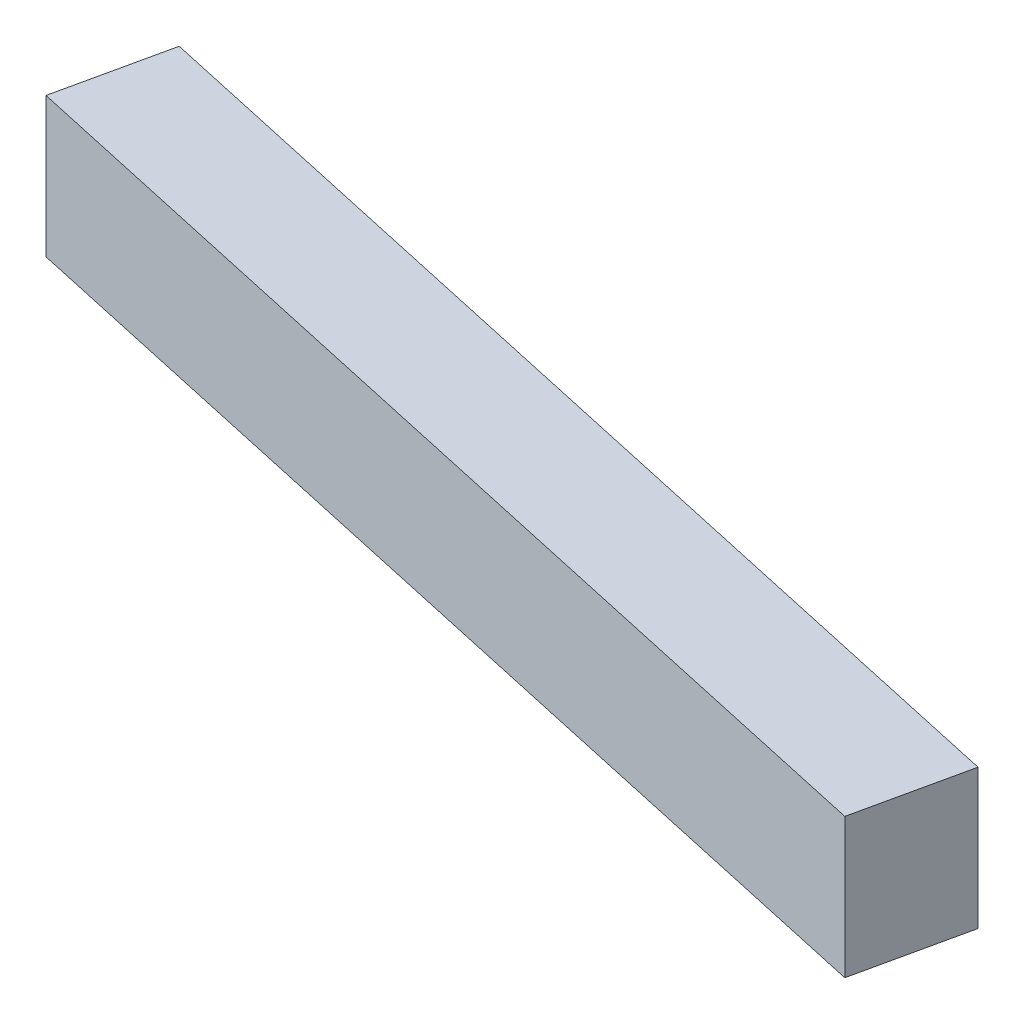
ISO-10303-21;
HEADER;
FILE_DESCRIPTION(('STEP AP214'),'2;1');
FILE_NAME('part.step','',(''),(''),'','','');
FILE_SCHEMA(('AUTOMOTIVE_DESIGN { 1 0 10303 214 1 1 1 1 }'));
ENDSEC;
DATA;
#1=APPLICATION_CONTEXT('core data for automotive mechanical design processes');
#2=APPLICATION_PROTOCOL_DEFINITION('international standard','automotive_design',2000,#1);
#3=PRODUCT_CONTEXT('',#1,'mechanical');
#4=PRODUCT('Part','Part','',(#3));
#5=PRODUCT_RELATED_PRODUCT_CATEGORY('part','',(#4));
#6=PRODUCT_DEFINITION_FORMATION('','',#4);
#7=PRODUCT_DEFINITION_CONTEXT('part definition',#1,'design');
#8=PRODUCT_DEFINITION('design','',#6,#7);
#9=PRODUCT_DEFINITION_SHAPE('','',#8);
#10=(LENGTH_UNIT() NAMED_UNIT(*) SI_UNIT(.MILLI.,.METRE.));
#11=(NAMED_UNIT(*) PLANE_ANGLE_UNIT() SI_UNIT($,.RADIAN.));
#12=(NAMED_UNIT(*) SI_UNIT($,.STERADIAN.) SOLID_ANGLE_UNIT());
#13=UNCERTAINTY_MEASURE_WITH_UNIT(LENGTH_MEASURE(1.E-05),#10,'distance_accuracy_value','');
#14=(GEOMETRIC_REPRESENTATION_CONTEXT(3) GLOBAL_UNCERTAINTY_ASSIGNED_CONTEXT((#13)) GLOBAL_UNIT_ASSIGNED_CONTEXT((#10,
#11,#12)) REPRESENTATION_CONTEXT('',''));
#15=CARTESIAN_POINT('',(0.,0.,0.));
#16=DIRECTION('',(0.,0.,1.));
#17=DIRECTION('',(1.,0.,0.));
#18=AXIS2_PLACEMENT_3D('',#15,#16,#17);
#19=CARTESIAN_POINT('',(-17.5987524858148,7.874,-3.76349059419512));
#20=DIRECTION('',(0.21459895589824,0.,-0.976702251521611));
#21=DIRECTION('',(-0.976702251521611,0.,-0.21459895589824));
#22=AXIS2_PLACEMENT_3D('',#19,#20,#21);
#23=PLANE('',#22);
#24=DIRECTION('',(0.,1.,0.));
#25=VECTOR('',#24,1.);
#26=CARTESIAN_POINT('',(-17.5987524858148,7.874,-3.76349059419512));
#27=LINE('',#26,#25);
#28=CARTESIAN_POINT('',(-17.5987524858148,7.62,-3.76349059419512));
#29=VERTEX_POINT('',#28);
#30=CARTESIAN_POINT('',(-17.5987524858148,7.874,-3.76349059419512));
#31=VERTEX_POINT('',#30);
#32=EDGE_CURVE('E20',#29,#31,#27,.T.);
#33=ORIENTED_EDGE('',*,*,#32,.T.);
#34=DIRECTION('',(-0.976702251521611,0.,-0.214598955898244));
#35=VECTOR('',#34,1.);
#36=CARTESIAN_POINT('',(-17.5987524858148,7.874,-3.76349059419512));
#37=LINE('',#36,#35);
#38=CARTESIAN_POINT('',(-19.4593702749634,7.874,-4.17230160518126));
#39=VERTEX_POINT('',#38);
#40=EDGE_CURVE('E55',#31,#39,#37,.T.);
#41=ORIENTED_EDGE('',*,*,#40,.T.);
#42=DIRECTION('',(0.,1.,0.));
#43=VECTOR('',#42,1.);
#44=CARTESIAN_POINT('',(-19.4593702749634,7.874,-4.17230160518126));
#45=LINE('',#44,#43);
#46=CARTESIAN_POINT('',(-19.4593702749634,7.62,-4.17230160518126));
#47=VERTEX_POINT('',#46);
#48=EDGE_CURVE('E76',#39,#47,#45,.F.);
#49=ORIENTED_EDGE('',*,*,#48,.T.);
#50=DIRECTION('',(-0.976702251521611,0.,-0.214598955898244));
#51=VECTOR('',#50,1.);
#52=CARTESIAN_POINT('',(-17.5987524858148,7.62,-3.76349059419512));
#53=LINE('',#52,#51);
#54=EDGE_CURVE('E58',#29,#47,#53,.T.);
#55=ORIENTED_EDGE('',*,*,#54,.F.);
#56=EDGE_LOOP('',(#33,#41,#49,#55));
#57=FACE_BOUND('',#56,.T.);
#58=ADVANCED_FACE('F17',(#57),#23,.F.);
#59=CARTESIAN_POINT('',(-17.5987524858148,7.874,-3.76349059419512));
#60=DIRECTION('',(-0.976702251521608,0.,-0.214598955898256));
#61=DIRECTION('',(-0.214598955898256,0.,0.976702251521608));
#62=AXIS2_PLACEMENT_3D('',#59,#60,#61);
#63=PLANE('',#62);
#64=DIRECTION('',(0.,1.,0.));
#65=VECTOR('',#64,1.);
#66=CARTESIAN_POINT('',(-17.5551459779762,7.874,-3.96195649170431));
#67=LINE('',#66,#65);
#68=CARTESIAN_POINT('',(-17.5551459779762,7.62,-3.96195649170432));
#69=VERTEX_POINT('',#68);
#70=CARTESIAN_POINT('',(-17.5551459779762,7.874,-3.96195649170432));
#71=VERTEX_POINT('',#70);
#72=EDGE_CURVE('E73',#69,#71,#67,.T.);
#73=ORIENTED_EDGE('',*,*,#72,.T.);
#74=DIRECTION('',(-0.214598955898602,0.,0.976702251521532));
#75=VECTOR('',#74,1.);
#76=CARTESIAN_POINT('',(-17.5551459779762,7.874,-3.96195649170431));
#77=LINE('',#76,#75);
#78=EDGE_CURVE('E63',#71,#31,#77,.T.);
#79=ORIENTED_EDGE('',*,*,#78,.T.);
#80=ORIENTED_EDGE('',*,*,#32,.F.);
#81=DIRECTION('',(-0.214598955898602,0.,0.976702251521532));
#82=VECTOR('',#81,1.);
#83=CARTESIAN_POINT('',(-17.5551459779762,7.62,-3.96195649170431));
#84=LINE('',#83,#82);
#85=EDGE_CURVE('E80',#69,#29,#84,.T.);
#86=ORIENTED_EDGE('',*,*,#85,.F.);
#87=EDGE_LOOP('',(#73,#79,#80,#86));
#88=FACE_BOUND('',#87,.T.);
#89=ADVANCED_FACE('F72',(#88),#63,.F.);
#90=CARTESIAN_POINT('',(-17.5987524858148,7.874,-3.76349059419512));
#91=DIRECTION('',(0.,-1.,0.));
#92=DIRECTION('',(0.,0.,-1.));
#93=AXIS2_PLACEMENT_3D('',#90,#91,#92);
#94=PLANE('',#93);
#95=ORIENTED_EDGE('',*,*,#78,.F.);
#96=DIRECTION('',(0.976702251521612,0.,0.214598955898237));
#97=VECTOR('',#96,1.);
#98=CARTESIAN_POINT('',(-17.5551459779762,7.874,-3.96195649170431));
#99=LINE('',#98,#97);
#100=CARTESIAN_POINT('',(-19.415763767427,7.874,-4.37076750275684));
#101=VERTEX_POINT('',#100);
#102=EDGE_CURVE('E83',#71,#101,#99,.F.);
#103=ORIENTED_EDGE('',*,*,#102,.T.);
#104=DIRECTION('',(0.214598954411368,0.,-0.976702251848304));
#105=VECTOR('',#104,1.);
#106=CARTESIAN_POINT('',(-19.4593702749634,7.874,-4.17230160518126));
#107=LINE('',#106,#105);
#108=EDGE_CURVE('E69',#101,#39,#107,.F.);
#109=ORIENTED_EDGE('',*,*,#108,.T.);
#110=ORIENTED_EDGE('',*,*,#40,.F.);
#111=EDGE_LOOP('',(#95,#103,#109,#110));
#112=FACE_BOUND('',#111,.T.);
#113=ADVANCED_FACE('F66',(#112),#94,.F.);
#114=CARTESIAN_POINT('',(-19.4593702749634,7.874,-4.17230160518126));
#115=DIRECTION('',(0.976702251848304,0.,0.214598954411368));
#116=DIRECTION('',(0.214598954411368,0.,-0.976702251848304));
#117=AXIS2_PLACEMENT_3D('',#114,#115,#116);
#118=PLANE('',#117);
#119=ORIENTED_EDGE('',*,*,#48,.F.);
#120=ORIENTED_EDGE('',*,*,#108,.F.);
#121=DIRECTION('',(0.,1.,0.));
#122=VECTOR('',#121,1.);
#123=CARTESIAN_POINT('',(-19.415763767427,7.874,-4.37076750275683));
#124=LINE('',#123,#122);
#125=CARTESIAN_POINT('',(-19.415763767427,7.62,-4.37076750275684));
#126=VERTEX_POINT('',#125);
#127=EDGE_CURVE('E26',#101,#126,#124,.F.);
#128=ORIENTED_EDGE('',*,*,#127,.T.);
#129=DIRECTION('',(0.214598954411426,0.,-0.976702251848291));
#130=VECTOR('',#129,1.);
#131=CARTESIAN_POINT('',(-19.4593702749634,7.62,-4.17230160518126));
#132=LINE('',#131,#130);
#133=EDGE_CURVE('E34',#47,#126,#132,.T.);
#134=ORIENTED_EDGE('',*,*,#133,.F.);
#135=EDGE_LOOP('',(#119,#120,#128,#134));
#136=FACE_BOUND('',#135,.T.);
#137=ADVANCED_FACE('F88',(#136),#118,.F.);
#138=CARTESIAN_POINT('',(-17.5987524858148,7.62,-3.76349059419512));
#139=DIRECTION('',(0.,-1.,0.));
#140=DIRECTION('',(0.,0.,-1.));
#141=AXIS2_PLACEMENT_3D('',#138,#139,#140);
#142=PLANE('',#141);
#143=DIRECTION('',(0.976702251521612,0.,0.214598955898237));
#144=VECTOR('',#143,1.);
#145=CARTESIAN_POINT('',(-17.5551459779762,7.62,-3.96195649170431));
#146=LINE('',#145,#144);
#147=EDGE_CURVE('E11',#126,#69,#146,.T.);
#148=ORIENTED_EDGE('',*,*,#147,.T.);
#149=ORIENTED_EDGE('',*,*,#85,.T.);
#150=ORIENTED_EDGE('',*,*,#54,.T.);
#151=ORIENTED_EDGE('',*,*,#133,.T.);
#152=EDGE_LOOP('',(#148,#149,#150,#151));
#153=FACE_BOUND('',#152,.T.);
#154=ADVANCED_FACE('F91',(#153),#142,.T.);
#155=CARTESIAN_POINT('',(-17.5551459779762,7.874,-3.96195649170431));
#156=DIRECTION('',(-0.214598955898237,0.,0.976702251521612));
#157=DIRECTION('',(0.976702251521612,0.,0.214598955898237));
#158=AXIS2_PLACEMENT_3D('',#155,#156,#157);
#159=PLANE('',#158);
#160=ORIENTED_EDGE('',*,*,#127,.F.);
#161=ORIENTED_EDGE('',*,*,#102,.F.);
#162=ORIENTED_EDGE('',*,*,#72,.F.);
#163=ORIENTED_EDGE('',*,*,#147,.F.);
#164=EDGE_LOOP('',(#160,#161,#162,#163));
#165=FACE_BOUND('',#164,.T.);
#166=ADVANCED_FACE('F90',(#165),#159,.F.);
#167=CLOSED_SHELL('',(#58,#89,#113,#137,#154,#166));
#168=MANIFOLD_SOLID_BREP('B1',#167);
#169=ADVANCED_BREP_SHAPE_REPRESENTATION('',(#18,#168),#14);
#170=SHAPE_DEFINITION_REPRESENTATION(#9,#169);
ENDSEC;
END-ISO-10303-21;
